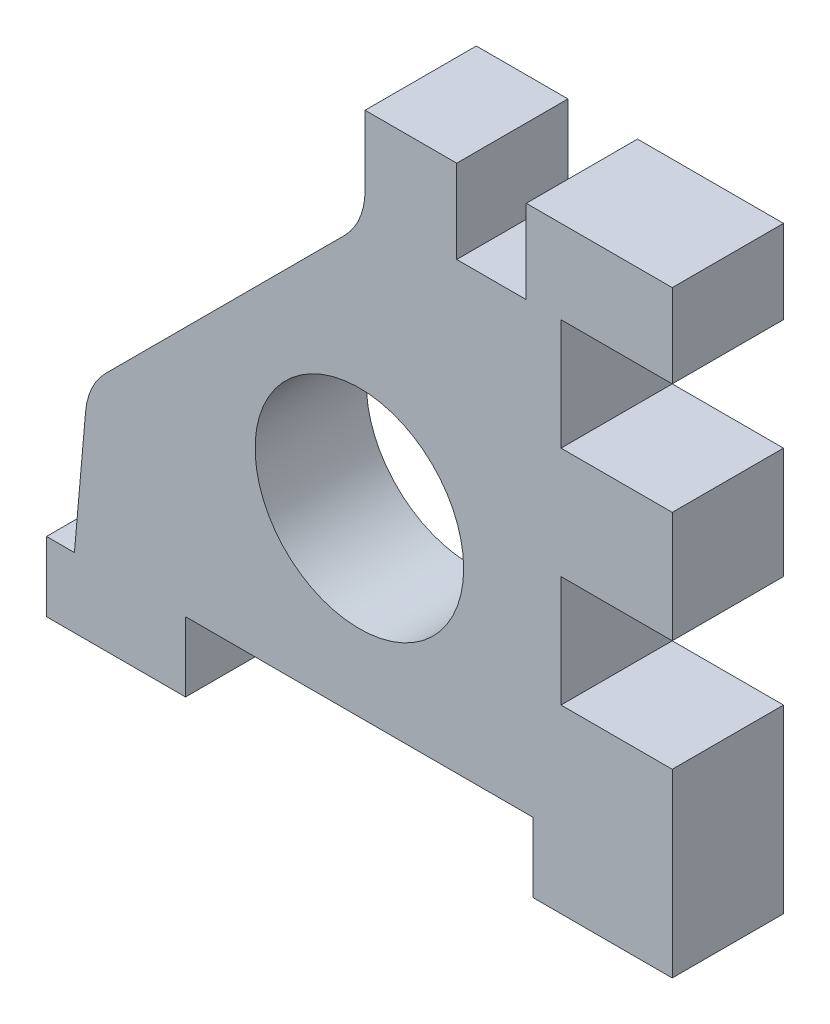
ISO-10303-21;
HEADER;
FILE_DESCRIPTION(('STEP AP214'),'2;1');
FILE_NAME('part.step','',(''),(''),'','','');
FILE_SCHEMA(('AUTOMOTIVE_DESIGN { 1 0 10303 214 1 1 1 1 }'));
ENDSEC;
DATA;
#1=APPLICATION_CONTEXT('core data for automotive mechanical design processes');
#2=APPLICATION_PROTOCOL_DEFINITION('international standard','automotive_design',2000,#1);
#3=PRODUCT_CONTEXT('',#1,'mechanical');
#4=PRODUCT('Part','Part','',(#3));
#5=PRODUCT_RELATED_PRODUCT_CATEGORY('part','',(#4));
#6=PRODUCT_DEFINITION_FORMATION('','',#4);
#7=PRODUCT_DEFINITION_CONTEXT('part definition',#1,'design');
#8=PRODUCT_DEFINITION('design','',#6,#7);
#9=PRODUCT_DEFINITION_SHAPE('','',#8);
#10=(LENGTH_UNIT() NAMED_UNIT(*) SI_UNIT(.MILLI.,.METRE.));
#11=(NAMED_UNIT(*) PLANE_ANGLE_UNIT() SI_UNIT($,.RADIAN.));
#12=(NAMED_UNIT(*) SI_UNIT($,.STERADIAN.) SOLID_ANGLE_UNIT());
#13=UNCERTAINTY_MEASURE_WITH_UNIT(LENGTH_MEASURE(1.E-05),#10,'distance_accuracy_value','');
#14=(GEOMETRIC_REPRESENTATION_CONTEXT(3) GLOBAL_UNCERTAINTY_ASSIGNED_CONTEXT((#13)) GLOBAL_UNIT_ASSIGNED_CONTEXT((#10,
#11,#12)) REPRESENTATION_CONTEXT('',''));
#15=CARTESIAN_POINT('',(0.,0.,0.));
#16=DIRECTION('',(0.,0.,1.));
#17=DIRECTION('',(1.,0.,0.));
#18=AXIS2_PLACEMENT_3D('',#15,#16,#17);
#19=CARTESIAN_POINT('',(45.,0.,8.));
#20=DIRECTION('',(-1.,0.,0.));
#21=DIRECTION('',(0.,0.,1.));
#22=AXIS2_PLACEMENT_3D('',#19,#20,#21);
#23=PLANE('',#22);
#24=DIRECTION('',(0.,1.,0.));
#25=VECTOR('',#24,1.);
#26=CARTESIAN_POINT('',(45.,0.,0.));
#27=LINE('',#26,#25);
#28=CARTESIAN_POINT('',(45.,16.,0.));
#29=VERTEX_POINT('',#28);
#30=CARTESIAN_POINT('',(45.,24.,0.));
#31=VERTEX_POINT('',#30);
#32=EDGE_CURVE('E378',#29,#31,#27,.T.);
#33=ORIENTED_EDGE('',*,*,#32,.T.);
#34=DIRECTION('',(0.,0.,1.));
#35=VECTOR('',#34,1.);
#36=CARTESIAN_POINT('',(45.,24.,8.));
#37=LINE('',#36,#35);
#38=CARTESIAN_POINT('',(45.,24.,8.));
#39=VERTEX_POINT('',#38);
#40=EDGE_CURVE('E42',#31,#39,#37,.T.);
#41=ORIENTED_EDGE('',*,*,#40,.T.);
#42=DIRECTION('',(0.,1.,0.));
#43=VECTOR('',#42,1.);
#44=CARTESIAN_POINT('',(45.,0.,8.));
#45=LINE('',#44,#43);
#46=CARTESIAN_POINT('',(45.,16.,8.));
#47=VERTEX_POINT('',#46);
#48=EDGE_CURVE('E231',#47,#39,#45,.T.);
#49=ORIENTED_EDGE('',*,*,#48,.F.);
#50=DIRECTION('',(0.,0.,-1.));
#51=VECTOR('',#50,1.);
#52=CARTESIAN_POINT('',(45.,16.,8.));
#53=LINE('',#52,#51);
#54=EDGE_CURVE('E269',#47,#29,#53,.T.);
#55=ORIENTED_EDGE('',*,*,#54,.T.);
#56=EDGE_LOOP('',(#33,#41,#49,#55));
#57=FACE_BOUND('',#56,.T.);
#58=ADVANCED_FACE('F34',(#57),#23,.F.);
#59=CARTESIAN_POINT('',(45.,-5.,0.));
#60=VERTEX_POINT('',#59);
#61=CARTESIAN_POINT('',(45.,8.,0.));
#62=VERTEX_POINT('',#61);
#63=EDGE_CURVE('E259',#60,#62,#27,.T.);
#64=ORIENTED_EDGE('',*,*,#63,.T.);
#65=DIRECTION('',(0.,0.,1.));
#66=VECTOR('',#65,1.);
#67=CARTESIAN_POINT('',(45.,8.,8.));
#68=LINE('',#67,#66);
#69=CARTESIAN_POINT('',(45.,8.,8.));
#70=VERTEX_POINT('',#69);
#71=EDGE_CURVE('E369',#62,#70,#68,.T.);
#72=ORIENTED_EDGE('',*,*,#71,.T.);
#73=CARTESIAN_POINT('',(45.,-5.,8.));
#74=VERTEX_POINT('',#73);
#75=EDGE_CURVE('E234',#74,#70,#45,.T.);
#76=ORIENTED_EDGE('',*,*,#75,.F.);
#77=DIRECTION('',(0.,0.,1.));
#78=VECTOR('',#77,1.);
#79=CARTESIAN_POINT('',(45.,-5.,8.));
#80=LINE('',#79,#78);
#81=EDGE_CURVE('E314',#60,#74,#80,.T.);
#82=ORIENTED_EDGE('',*,*,#81,.F.);
#83=EDGE_LOOP('',(#64,#72,#76,#82));
#84=FACE_BOUND('',#83,.T.);
#85=ADVANCED_FACE('F367',(#84),#23,.F.);
#86=CARTESIAN_POINT('',(45.,0.,8.));
#87=DIRECTION('',(0.,1.,0.));
#88=DIRECTION('',(-1.,0.,0.));
#89=AXIS2_PLACEMENT_3D('',#86,#87,#88);
#90=PLANE('',#89);
#91=DIRECTION('',(0.,0.,1.));
#92=VECTOR('',#91,1.);
#93=CARTESIAN_POINT('',(10.,0.,8.));
#94=LINE('',#93,#92);
#95=CARTESIAN_POINT('',(10.,0.,0.));
#96=VERTEX_POINT('',#95);
#97=CARTESIAN_POINT('',(10.,0.,8.));
#98=VERTEX_POINT('',#97);
#99=EDGE_CURVE('E340',#96,#98,#94,.T.);
#100=ORIENTED_EDGE('',*,*,#99,.F.);
#101=DIRECTION('',(1.,0.,0.));
#102=VECTOR('',#101,1.);
#103=CARTESIAN_POINT('',(45.,0.,0.));
#104=LINE('',#103,#102);
#105=CARTESIAN_POINT('',(35.,0.,0.));
#106=VERTEX_POINT('',#105);
#107=EDGE_CURVE('E262',#96,#106,#104,.T.);
#108=ORIENTED_EDGE('',*,*,#107,.T.);
#109=DIRECTION('',(0.,0.,-1.));
#110=VECTOR('',#109,1.);
#111=CARTESIAN_POINT('',(35.,0.,8.));
#112=LINE('',#111,#110);
#113=CARTESIAN_POINT('',(35.,0.,8.));
#114=VERTEX_POINT('',#113);
#115=EDGE_CURVE('E310',#114,#106,#112,.T.);
#116=ORIENTED_EDGE('',*,*,#115,.F.);
#117=DIRECTION('',(1.,0.,0.));
#118=VECTOR('',#117,1.);
#119=CARTESIAN_POINT('',(45.,0.,8.));
#120=LINE('',#119,#118);
#121=EDGE_CURVE('E232',#98,#114,#120,.T.);
#122=ORIENTED_EDGE('',*,*,#121,.F.);
#123=EDGE_LOOP('',(#100,#108,#116,#122));
#124=FACE_BOUND('',#123,.T.);
#125=ADVANCED_FACE('F338',(#124),#90,.F.);
#126=CARTESIAN_POINT('',(22.9087862886784,37.9987713148062,8.));
#127=DIRECTION('',(0.,-1.,0.));
#128=DIRECTION('',(0.,0.,-1.));
#129=AXIS2_PLACEMENT_3D('',#126,#127,#128);
#130=PLANE('',#129);
#131=DIRECTION('',(-1.,0.,0.));
#132=VECTOR('',#131,1.);
#133=CARTESIAN_POINT('',(22.9087862886784,37.9987713148062,8.));
#134=LINE('',#133,#132);
#135=CARTESIAN_POINT('',(29.5,37.9987713148063,8.));
#136=VERTEX_POINT('',#135);
#137=CARTESIAN_POINT('',(22.9087862886784,37.9987713148062,8.));
#138=VERTEX_POINT('',#137);
#139=EDGE_CURVE('E240',#136,#138,#134,.T.);
#140=ORIENTED_EDGE('',*,*,#139,.F.);
#141=DIRECTION('',(0.,0.,1.));
#142=VECTOR('',#141,1.);
#143=CARTESIAN_POINT('',(29.5,37.9987713148063,0.));
#144=LINE('',#143,#142);
#145=CARTESIAN_POINT('',(29.5,37.9987713148063,0.));
#146=VERTEX_POINT('',#145);
#147=EDGE_CURVE('E276',#146,#136,#144,.T.);
#148=ORIENTED_EDGE('',*,*,#147,.F.);
#149=DIRECTION('',(-1.,0.,0.));
#150=VECTOR('',#149,1.);
#151=CARTESIAN_POINT('',(22.9087862886784,37.9987713148062,0.));
#152=LINE('',#151,#150);
#153=CARTESIAN_POINT('',(22.9087862886784,37.9987713148062,0.));
#154=VERTEX_POINT('',#153);
#155=EDGE_CURVE('E517',#146,#154,#152,.T.);
#156=ORIENTED_EDGE('',*,*,#155,.T.);
#157=DIRECTION('',(0.,0.,-1.));
#158=VECTOR('',#157,1.);
#159=CARTESIAN_POINT('',(22.9087862886784,37.9987713148062,8.));
#160=LINE('',#159,#158);
#161=EDGE_CURVE('E488',#138,#154,#160,.T.);
#162=ORIENTED_EDGE('',*,*,#161,.F.);
#163=EDGE_LOOP('',(#140,#148,#156,#162));
#164=FACE_BOUND('',#163,.T.);
#165=ADVANCED_FACE('F460',(#164),#130,.F.);
#166=CARTESIAN_POINT('',(0.,0.,8.));
#167=DIRECTION('',(0.,0.,-1.));
#168=DIRECTION('',(-1.,0.,0.));
#169=AXIS2_PLACEMENT_3D('',#166,#167,#168);
#170=PLANE('',#169);
#171=ORIENTED_EDGE('',*,*,#48,.T.);
#172=DIRECTION('',(1.,0.,0.));
#173=VECTOR('',#172,1.);
#174=CARTESIAN_POINT('',(45.,24.,8.));
#175=LINE('',#174,#173);
#176=CARTESIAN_POINT('',(37.,24.,8.));
#177=VERTEX_POINT('',#176);
#178=EDGE_CURVE('E381',#177,#39,#175,.T.);
#179=ORIENTED_EDGE('',*,*,#178,.F.);
#180=DIRECTION('',(0.,-1.,0.));
#181=VECTOR('',#180,1.);
#182=CARTESIAN_POINT('',(37.,24.,8.));
#183=LINE('',#182,#181);
#184=CARTESIAN_POINT('',(37.,32.,8.));
#185=VERTEX_POINT('',#184);
#186=EDGE_CURVE('E225',#185,#177,#183,.T.);
#187=ORIENTED_EDGE('',*,*,#186,.F.);
#188=DIRECTION('',(-1.,0.,0.));
#189=VECTOR('',#188,1.);
#190=CARTESIAN_POINT('',(45.,32.,8.));
#191=LINE('',#190,#189);
#192=CARTESIAN_POINT('',(45.,32.,8.));
#193=VERTEX_POINT('',#192);
#194=EDGE_CURVE('E209',#193,#185,#191,.T.);
#195=ORIENTED_EDGE('',*,*,#194,.F.);
#196=CARTESIAN_POINT('',(45.,37.9987713148062,8.));
#197=VERTEX_POINT('',#196);
#198=EDGE_CURVE('E221',#193,#197,#45,.T.);
#199=ORIENTED_EDGE('',*,*,#198,.T.);
#200=CARTESIAN_POINT('',(34.5,37.9987713148062,8.));
#201=VERTEX_POINT('',#200);
#202=EDGE_CURVE('E243',#197,#201,#134,.T.);
#203=ORIENTED_EDGE('',*,*,#202,.T.);
#204=DIRECTION('',(0.,1.,0.));
#205=VECTOR('',#204,1.);
#206=CARTESIAN_POINT('',(34.5,37.9987713148062,8.));
#207=LINE('',#206,#205);
#208=CARTESIAN_POINT('',(34.5,31.9987713148063,8.));
#209=VERTEX_POINT('',#208);
#210=EDGE_CURVE('E288',#209,#201,#207,.T.);
#211=ORIENTED_EDGE('',*,*,#210,.F.);
#212=DIRECTION('',(1.,0.,0.));
#213=VECTOR('',#212,1.);
#214=CARTESIAN_POINT('',(29.5,31.9987713148063,8.));
#215=LINE('',#214,#213);
#216=CARTESIAN_POINT('',(29.5,31.9987713148063,8.));
#217=VERTEX_POINT('',#216);
#218=EDGE_CURVE('E291',#217,#209,#215,.T.);
#219=ORIENTED_EDGE('',*,*,#218,.F.);
#220=DIRECTION('',(0.,-1.,0.));
#221=VECTOR('',#220,1.);
#222=CARTESIAN_POINT('',(29.5,37.9987713148063,8.));
#223=LINE('',#222,#221);
#224=EDGE_CURVE('E294',#136,#217,#223,.T.);
#225=ORIENTED_EDGE('',*,*,#224,.F.);
#226=ORIENTED_EDGE('',*,*,#139,.T.);
#227=DIRECTION('',(0.,-1.,0.));
#228=VECTOR('',#227,1.);
#229=CARTESIAN_POINT('',(22.9087862886784,30.9387713148062,8.));
#230=LINE('',#229,#228);
#231=CARTESIAN_POINT('',(22.9087862886784,33.0098391266717,8.));
#232=VERTEX_POINT('',#231);
#233=EDGE_CURVE('E248',#138,#232,#230,.T.);
#234=ORIENTED_EDGE('',*,*,#233,.T.);
#235=CARTESIAN_POINT('',(17.9087862886783,33.0098391266717,8.));
#236=DIRECTION('',(0.,0.,-1.));
#237=DIRECTION('',(-1.,0.,0.));
#238=AXIS2_PLACEMENT_3D('',#235,#236,#237);
#239=CIRCLE('',#238,5.);
#240=CARTESIAN_POINT('',(21.4443201946111,29.474305220739,8.));
#241=VERTEX_POINT('',#240);
#242=EDGE_CURVE('E316',#232,#241,#239,.T.);
#243=ORIENTED_EDGE('',*,*,#242,.T.);
#244=DIRECTION('',(-0.707106781186551,-0.707106781186544,0.));
#245=VECTOR('',#244,1.);
#246=CARTESIAN_POINT('',(2.9700149738719,11.,8.));
#247=LINE('',#246,#245);
#248=CARTESIAN_POINT('',(4.25684407787035,12.2868291039984,8.));
#249=VERTEX_POINT('',#248);
#250=EDGE_CURVE('E251',#241,#249,#247,.T.);
#251=ORIENTED_EDGE('',*,*,#250,.T.);
#252=CARTESIAN_POINT('',(7.79237798380307,8.75129519806568,8.));
#253=DIRECTION('',(0.,0.,-1.));
#254=DIRECTION('',(-1.,0.,0.));
#255=AXIS2_PLACEMENT_3D('',#252,#253,#254);
#256=CIRCLE('',#255,5.);
#257=CARTESIAN_POINT('',(2.81140449334434,9.18707391180399,8.));
#258=VERTEX_POINT('',#257);
#259=EDGE_CURVE('E498',#249,#258,#256,.F.);
#260=ORIENTED_EDGE('',*,*,#259,.T.);
#261=DIRECTION('',(-0.0871557427476618,-0.996194698091745,0.));
#262=VECTOR('',#261,1.);
#263=CARTESIAN_POINT('',(2.00763967508669,0.,8.));
#264=LINE('',#263,#262);
#265=CARTESIAN_POINT('',(2.00763967508669,0.,8.));
#266=VERTEX_POINT('',#265);
#267=EDGE_CURVE('E254',#258,#266,#264,.T.);
#268=ORIENTED_EDGE('',*,*,#267,.T.);
#269=DIRECTION('',(-1.,0.,0.));
#270=VECTOR('',#269,1.);
#271=CARTESIAN_POINT('',(0.,0.,8.));
#272=LINE('',#271,#270);
#273=CARTESIAN_POINT('',(0.,0.,8.));
#274=VERTEX_POINT('',#273);
#275=EDGE_CURVE('E407',#266,#274,#272,.T.);
#276=ORIENTED_EDGE('',*,*,#275,.T.);
#277=DIRECTION('',(0.,1.,0.));
#278=VECTOR('',#277,1.);
#279=CARTESIAN_POINT('',(0.,-5.,8.));
#280=LINE('',#279,#278);
#281=CARTESIAN_POINT('',(0.,-5.,8.));
#282=VERTEX_POINT('',#281);
#283=EDGE_CURVE('E356',#282,#274,#280,.T.);
#284=ORIENTED_EDGE('',*,*,#283,.F.);
#285=DIRECTION('',(-1.,0.,0.));
#286=VECTOR('',#285,1.);
#287=CARTESIAN_POINT('',(0.,-5.,8.));
#288=LINE('',#287,#286);
#289=CARTESIAN_POINT('',(10.,-5.,8.));
#290=VERTEX_POINT('',#289);
#291=EDGE_CURVE('E410',#290,#282,#288,.T.);
#292=ORIENTED_EDGE('',*,*,#291,.F.);
#293=DIRECTION('',(0.,1.,0.));
#294=VECTOR('',#293,1.);
#295=CARTESIAN_POINT('',(10.,-5.,8.));
#296=LINE('',#295,#294);
#297=EDGE_CURVE('E335',#290,#98,#296,.T.);
#298=ORIENTED_EDGE('',*,*,#297,.T.);
#299=ORIENTED_EDGE('',*,*,#121,.T.);
#300=DIRECTION('',(0.,1.,0.));
#301=VECTOR('',#300,1.);
#302=CARTESIAN_POINT('',(35.,-5.,8.));
#303=LINE('',#302,#301);
#304=CARTESIAN_POINT('',(35.,-5.,8.));
#305=VERTEX_POINT('',#304);
#306=EDGE_CURVE('E297',#305,#114,#303,.T.);
#307=ORIENTED_EDGE('',*,*,#306,.F.);
#308=DIRECTION('',(-1.,0.,0.));
#309=VECTOR('',#308,1.);
#310=CARTESIAN_POINT('',(45.,-5.,8.));
#311=LINE('',#310,#309);
#312=EDGE_CURVE('E330',#74,#305,#311,.T.);
#313=ORIENTED_EDGE('',*,*,#312,.F.);
#314=ORIENTED_EDGE('',*,*,#75,.T.);
#315=DIRECTION('',(1.,0.,0.));
#316=VECTOR('',#315,1.);
#317=CARTESIAN_POINT('',(45.,8.,8.));
#318=LINE('',#317,#316);
#319=CARTESIAN_POINT('',(37.,8.,8.));
#320=VERTEX_POINT('',#319);
#321=EDGE_CURVE('E389',#320,#70,#318,.T.);
#322=ORIENTED_EDGE('',*,*,#321,.F.);
#323=DIRECTION('',(0.,-1.,0.));
#324=VECTOR('',#323,1.);
#325=CARTESIAN_POINT('',(37.,8.,8.));
#326=LINE('',#325,#324);
#327=CARTESIAN_POINT('',(37.,16.,8.));
#328=VERTEX_POINT('',#327);
#329=EDGE_CURVE('E386',#328,#320,#326,.T.);
#330=ORIENTED_EDGE('',*,*,#329,.F.);
#331=DIRECTION('',(-1.,0.,0.));
#332=VECTOR('',#331,1.);
#333=CARTESIAN_POINT('',(45.,16.,8.));
#334=LINE('',#333,#332);
#335=EDGE_CURVE('E384',#47,#328,#334,.T.);
#336=ORIENTED_EDGE('',*,*,#335,.F.);
#337=EDGE_LOOP('',(#171,#179,#187,#195,#199,#203,#211,#219,#225,#226,#234,#243,#251,#260,#268,
#276,#284,#292,#298,#299,#307,#313,#314,#322,#330,#336));
#338=FACE_BOUND('',#337,.T.);
#339=CARTESIAN_POINT('',(22.5,13.,8.));
#340=DIRECTION('',(0.,0.,1.));
#341=DIRECTION('',(1.,0.,0.));
#342=AXIS2_PLACEMENT_3D('',#339,#340,#341);
#343=CIRCLE('',#342,7.5);
#344=CARTESIAN_POINT('',(30.,13.,8.));
#345=VERTEX_POINT('',#344);
#346=EDGE_CURVE('E265',#345,#345,#343,.T.);
#347=ORIENTED_EDGE('',*,*,#346,.F.);
#348=EDGE_LOOP('',(#347));
#349=FACE_BOUND('',#348,.T.);
#350=ADVANCED_FACE('F218',(#338,#349),#170,.F.);
#351=CARTESIAN_POINT('',(0.,0.,0.));
#352=DIRECTION('',(0.,0.,-1.));
#353=DIRECTION('',(-1.,0.,0.));
#354=AXIS2_PLACEMENT_3D('',#351,#352,#353);
#355=PLANE('',#354);
#356=DIRECTION('',(-1.,0.,0.));
#357=VECTOR('',#356,1.);
#358=CARTESIAN_POINT('',(0.,24.,0.));
#359=LINE('',#358,#357);
#360=CARTESIAN_POINT('',(37.,24.,0.));
#361=VERTEX_POINT('',#360);
#362=EDGE_CURVE('E387',#31,#361,#359,.T.);
#363=ORIENTED_EDGE('',*,*,#362,.F.);
#364=ORIENTED_EDGE('',*,*,#32,.F.);
#365=DIRECTION('',(1.,0.,0.));
#366=VECTOR('',#365,1.);
#367=CARTESIAN_POINT('',(0.,16.,0.));
#368=LINE('',#367,#366);
#369=CARTESIAN_POINT('',(37.,16.,0.));
#370=VERTEX_POINT('',#369);
#371=EDGE_CURVE('E57',#370,#29,#368,.T.);
#372=ORIENTED_EDGE('',*,*,#371,.F.);
#373=DIRECTION('',(0.,1.,0.));
#374=VECTOR('',#373,1.);
#375=CARTESIAN_POINT('',(37.,0.,0.));
#376=LINE('',#375,#374);
#377=CARTESIAN_POINT('',(37.,8.,0.));
#378=VERTEX_POINT('',#377);
#379=EDGE_CURVE('E214',#378,#370,#376,.T.);
#380=ORIENTED_EDGE('',*,*,#379,.F.);
#381=DIRECTION('',(-1.,0.,0.));
#382=VECTOR('',#381,1.);
#383=CARTESIAN_POINT('',(0.,7.99999999999999,0.));
#384=LINE('',#383,#382);
#385=EDGE_CURVE('E400',#62,#378,#384,.T.);
#386=ORIENTED_EDGE('',*,*,#385,.F.);
#387=ORIENTED_EDGE('',*,*,#63,.F.);
#388=DIRECTION('',(1.,0.,0.));
#389=VECTOR('',#388,1.);
#390=CARTESIAN_POINT('',(45.,-5.,0.));
#391=LINE('',#390,#389);
#392=CARTESIAN_POINT('',(35.,-5.,0.));
#393=VERTEX_POINT('',#392);
#394=EDGE_CURVE('E307',#393,#60,#391,.T.);
#395=ORIENTED_EDGE('',*,*,#394,.F.);
#396=DIRECTION('',(0.,1.,0.));
#397=VECTOR('',#396,1.);
#398=CARTESIAN_POINT('',(35.,-5.,0.));
#399=LINE('',#398,#397);
#400=EDGE_CURVE('E318',#393,#106,#399,.T.);
#401=ORIENTED_EDGE('',*,*,#400,.T.);
#402=ORIENTED_EDGE('',*,*,#107,.F.);
#403=DIRECTION('',(0.,1.,0.));
#404=VECTOR('',#403,1.);
#405=CARTESIAN_POINT('',(10.,-5.,0.));
#406=LINE('',#405,#404);
#407=CARTESIAN_POINT('',(10.,-5.,0.));
#408=VERTEX_POINT('',#407);
#409=EDGE_CURVE('E347',#408,#96,#406,.T.);
#410=ORIENTED_EDGE('',*,*,#409,.F.);
#411=DIRECTION('',(1.,0.,0.));
#412=VECTOR('',#411,1.);
#413=CARTESIAN_POINT('',(0.,-5.,0.));
#414=LINE('',#413,#412);
#415=CARTESIAN_POINT('',(0.,-5.,0.));
#416=VERTEX_POINT('',#415);
#417=EDGE_CURVE('E406',#416,#408,#414,.T.);
#418=ORIENTED_EDGE('',*,*,#417,.F.);
#419=DIRECTION('',(0.,1.,0.));
#420=VECTOR('',#419,1.);
#421=CARTESIAN_POINT('',(0.,-5.,0.));
#422=LINE('',#421,#420);
#423=CARTESIAN_POINT('',(0.,0.,0.));
#424=VERTEX_POINT('',#423);
#425=EDGE_CURVE('E315',#416,#424,#422,.T.);
#426=ORIENTED_EDGE('',*,*,#425,.T.);
#427=DIRECTION('',(1.,0.,0.));
#428=VECTOR('',#427,1.);
#429=CARTESIAN_POINT('',(0.,0.,0.));
#430=LINE('',#429,#428);
#431=CARTESIAN_POINT('',(2.0076396750867,0.,0.));
#432=VERTEX_POINT('',#431);
#433=EDGE_CURVE('E414',#424,#432,#430,.T.);
#434=ORIENTED_EDGE('',*,*,#433,.T.);
#435=DIRECTION('',(-0.0871557427476618,-0.996194698091745,0.));
#436=VECTOR('',#435,1.);
#437=CARTESIAN_POINT('',(2.00763967508669,0.,0.));
#438=LINE('',#437,#436);
#439=CARTESIAN_POINT('',(2.81140449334434,9.18707391180399,0.));
#440=VERTEX_POINT('',#439);
#441=EDGE_CURVE('E235',#440,#432,#438,.T.);
#442=ORIENTED_EDGE('',*,*,#441,.F.);
#443=CARTESIAN_POINT('',(7.79237798380307,8.75129519806568,0.));
#444=DIRECTION('',(0.,0.,-1.));
#445=DIRECTION('',(-1.,0.,0.));
#446=AXIS2_PLACEMENT_3D('',#443,#444,#445);
#447=CIRCLE('',#446,5.);
#448=CARTESIAN_POINT('',(4.25684407787035,12.2868291039984,0.));
#449=VERTEX_POINT('',#448);
#450=EDGE_CURVE('E506',#440,#449,#447,.T.);
#451=ORIENTED_EDGE('',*,*,#450,.T.);
#452=DIRECTION('',(-0.707106781186551,-0.707106781186544,0.));
#453=VECTOR('',#452,1.);
#454=CARTESIAN_POINT('',(2.9700149738719,11.,0.));
#455=LINE('',#454,#453);
#456=CARTESIAN_POINT('',(21.4443201946111,29.474305220739,0.));
#457=VERTEX_POINT('',#456);
#458=EDGE_CURVE('E490',#457,#449,#455,.T.);
#459=ORIENTED_EDGE('',*,*,#458,.F.);
#460=CARTESIAN_POINT('',(17.9087862886783,33.0098391266717,0.));
#461=DIRECTION('',(0.,0.,-1.));
#462=DIRECTION('',(-1.,0.,0.));
#463=AXIS2_PLACEMENT_3D('',#460,#461,#462);
#464=CIRCLE('',#463,5.);
#465=CARTESIAN_POINT('',(22.9087862886784,33.0098391266717,0.));
#466=VERTEX_POINT('',#465);
#467=EDGE_CURVE('E496',#457,#466,#464,.F.);
#468=ORIENTED_EDGE('',*,*,#467,.T.);
#469=DIRECTION('',(0.,-1.,0.));
#470=VECTOR('',#469,1.);
#471=CARTESIAN_POINT('',(22.9087862886784,30.9387713148062,0.));
#472=LINE('',#471,#470);
#473=EDGE_CURVE('E484',#154,#466,#472,.T.);
#474=ORIENTED_EDGE('',*,*,#473,.F.);
#475=ORIENTED_EDGE('',*,*,#155,.F.);
#476=DIRECTION('',(0.,-1.,0.));
#477=VECTOR('',#476,1.);
#478=CARTESIAN_POINT('',(29.5,37.9987713148063,0.));
#479=LINE('',#478,#477);
#480=CARTESIAN_POINT('',(29.5,31.9987713148063,0.));
#481=VERTEX_POINT('',#480);
#482=EDGE_CURVE('E290',#146,#481,#479,.T.);
#483=ORIENTED_EDGE('',*,*,#482,.T.);
#484=DIRECTION('',(1.,0.,0.));
#485=VECTOR('',#484,1.);
#486=CARTESIAN_POINT('',(29.5,31.9987713148063,0.));
#487=LINE('',#486,#485);
#488=CARTESIAN_POINT('',(34.5,31.9987713148063,0.));
#489=VERTEX_POINT('',#488);
#490=EDGE_CURVE('E300',#481,#489,#487,.T.);
#491=ORIENTED_EDGE('',*,*,#490,.T.);
#492=DIRECTION('',(0.,1.,0.));
#493=VECTOR('',#492,1.);
#494=CARTESIAN_POINT('',(34.5,37.9987713148062,0.));
#495=LINE('',#494,#493);
#496=CARTESIAN_POINT('',(34.5,37.9987713148062,0.));
#497=VERTEX_POINT('',#496);
#498=EDGE_CURVE('E282',#489,#497,#495,.T.);
#499=ORIENTED_EDGE('',*,*,#498,.T.);
#500=CARTESIAN_POINT('',(45.,37.9987713148062,0.));
#501=VERTEX_POINT('',#500);
#502=EDGE_CURVE('E491',#501,#497,#152,.T.);
#503=ORIENTED_EDGE('',*,*,#502,.F.);
#504=CARTESIAN_POINT('',(45.,32.,0.));
#505=VERTEX_POINT('',#504);
#506=EDGE_CURVE('E264',#505,#501,#27,.T.);
#507=ORIENTED_EDGE('',*,*,#506,.F.);
#508=DIRECTION('',(1.,0.,0.));
#509=VECTOR('',#508,1.);
#510=CARTESIAN_POINT('',(0.,32.,0.));
#511=LINE('',#510,#509);
#512=CARTESIAN_POINT('',(37.,32.,0.));
#513=VERTEX_POINT('',#512);
#514=EDGE_CURVE('E49',#513,#505,#511,.T.);
#515=ORIENTED_EDGE('',*,*,#514,.F.);
#516=DIRECTION('',(0.,1.,0.));
#517=VECTOR('',#516,1.);
#518=CARTESIAN_POINT('',(37.,0.,0.));
#519=LINE('',#518,#517);
#520=EDGE_CURVE('E11',#361,#513,#519,.T.);
#521=ORIENTED_EDGE('',*,*,#520,.F.);
#522=EDGE_LOOP('',(#363,#364,#372,#380,#386,#387,#395,#401,#402,#410,#418,#426,#434,#442,#451,
#459,#468,#474,#475,#483,#491,#499,#503,#507,#515,#521));
#523=FACE_BOUND('',#522,.T.);
#524=CARTESIAN_POINT('',(22.5,13.,0.));
#525=DIRECTION('',(0.,0.,1.));
#526=DIRECTION('',(1.,0.,0.));
#527=AXIS2_PLACEMENT_3D('',#524,#525,#526);
#528=CIRCLE('',#527,7.5);
#529=CARTESIAN_POINT('',(30.,13.,0.));
#530=VERTEX_POINT('',#529);
#531=EDGE_CURVE('E273',#530,#530,#528,.T.);
#532=ORIENTED_EDGE('',*,*,#531,.T.);
#533=EDGE_LOOP('',(#532));
#534=FACE_BOUND('',#533,.T.);
#535=ADVANCED_FACE('F345',(#523,#534),#355,.T.);
#536=ORIENTED_EDGE('',*,*,#198,.F.);
#537=DIRECTION('',(0.,0.,-1.));
#538=VECTOR('',#537,1.);
#539=CARTESIAN_POINT('',(45.,32.,8.));
#540=LINE('',#539,#538);
#541=EDGE_CURVE('E206',#193,#505,#540,.T.);
#542=ORIENTED_EDGE('',*,*,#541,.T.);
#543=ORIENTED_EDGE('',*,*,#506,.T.);
#544=DIRECTION('',(0.,0.,-1.));
#545=VECTOR('',#544,1.);
#546=CARTESIAN_POINT('',(45.,37.9987713148062,8.));
#547=LINE('',#546,#545);
#548=EDGE_CURVE('E229',#197,#501,#547,.T.);
#549=ORIENTED_EDGE('',*,*,#548,.F.);
#550=EDGE_LOOP('',(#536,#542,#543,#549));
#551=FACE_BOUND('',#550,.T.);
#552=ADVANCED_FACE('F227',(#551),#23,.F.);
#553=ORIENTED_EDGE('',*,*,#502,.T.);
#554=DIRECTION('',(0.,0.,1.));
#555=VECTOR('',#554,1.);
#556=CARTESIAN_POINT('',(34.5,37.9987713148062,0.));
#557=LINE('',#556,#555);
#558=EDGE_CURVE('E284',#497,#201,#557,.T.);
#559=ORIENTED_EDGE('',*,*,#558,.T.);
#560=ORIENTED_EDGE('',*,*,#202,.F.);
#561=ORIENTED_EDGE('',*,*,#548,.T.);
#562=EDGE_LOOP('',(#553,#559,#560,#561));
#563=FACE_BOUND('',#562,.T.);
#564=ADVANCED_FACE('F453',(#563),#130,.F.);
#565=CARTESIAN_POINT('',(22.9087862886784,30.9387713148062,8.));
#566=DIRECTION('',(1.,0.,0.));
#567=DIRECTION('',(0.,1.,0.));
#568=AXIS2_PLACEMENT_3D('',#565,#566,#567);
#569=PLANE('',#568);
#570=ORIENTED_EDGE('',*,*,#473,.T.);
#571=DIRECTION('',(0.,0.,-1.));
#572=VECTOR('',#571,1.);
#573=CARTESIAN_POINT('',(22.9087862886784,33.0098391266717,8.));
#574=LINE('',#573,#572);
#575=EDGE_CURVE('E487',#466,#232,#574,.F.);
#576=ORIENTED_EDGE('',*,*,#575,.T.);
#577=ORIENTED_EDGE('',*,*,#233,.F.);
#578=ORIENTED_EDGE('',*,*,#161,.T.);
#579=EDGE_LOOP('',(#570,#576,#577,#578));
#580=FACE_BOUND('',#579,.T.);
#581=ADVANCED_FACE('F458',(#580),#569,.F.);
#582=CARTESIAN_POINT('',(2.9700149738719,11.,8.));
#583=DIRECTION('',(0.707106781186544,-0.707106781186551,0.));
#584=DIRECTION('',(0.707106781186551,0.707106781186544,0.));
#585=AXIS2_PLACEMENT_3D('',#582,#583,#584);
#586=PLANE('',#585);
#587=ORIENTED_EDGE('',*,*,#458,.T.);
#588=DIRECTION('',(0.,0.,-1.));
#589=VECTOR('',#588,1.);
#590=CARTESIAN_POINT('',(4.25684407787035,12.2868291039984,8.));
#591=LINE('',#590,#589);
#592=EDGE_CURVE('E500',#449,#249,#591,.F.);
#593=ORIENTED_EDGE('',*,*,#592,.T.);
#594=ORIENTED_EDGE('',*,*,#250,.F.);
#595=DIRECTION('',(0.,0.,-1.));
#596=VECTOR('',#595,1.);
#597=CARTESIAN_POINT('',(21.4443201946111,29.474305220739,0.));
#598=LINE('',#597,#596);
#599=EDGE_CURVE('E504',#241,#457,#598,.T.);
#600=ORIENTED_EDGE('',*,*,#599,.T.);
#601=EDGE_LOOP('',(#587,#593,#594,#600));
#602=FACE_BOUND('',#601,.T.);
#603=ADVANCED_FACE('F472',(#602),#586,.F.);
#604=CARTESIAN_POINT('',(2.00763967508669,0.,8.));
#605=DIRECTION('',(0.996194698091745,-0.0871557427476618,0.));
#606=DIRECTION('',(0.0871557427476618,0.996194698091745,0.));
#607=AXIS2_PLACEMENT_3D('',#604,#605,#606);
#608=PLANE('',#607);
#609=ORIENTED_EDGE('',*,*,#267,.F.);
#610=DIRECTION('',(0.,0.,-1.));
#611=VECTOR('',#610,1.);
#612=CARTESIAN_POINT('',(2.81140449334434,9.18707391180399,8.));
#613=LINE('',#612,#611);
#614=EDGE_CURVE('E508',#258,#440,#613,.T.);
#615=ORIENTED_EDGE('',*,*,#614,.T.);
#616=ORIENTED_EDGE('',*,*,#441,.T.);
#617=DIRECTION('',(0.,0.,-1.));
#618=VECTOR('',#617,1.);
#619=CARTESIAN_POINT('',(2.00763967508669,0.,8.));
#620=LINE('',#619,#618);
#621=EDGE_CURVE('E256',#266,#432,#620,.T.);
#622=ORIENTED_EDGE('',*,*,#621,.F.);
#623=EDGE_LOOP('',(#609,#615,#616,#622));
#624=FACE_BOUND('',#623,.T.);
#625=ADVANCED_FACE('F468',(#624),#608,.F.);
#626=CARTESIAN_POINT('',(22.5,13.,8.));
#627=DIRECTION('',(0.,0.,-1.));
#628=DIRECTION('',(-1.,0.,0.));
#629=AXIS2_PLACEMENT_3D('',#626,#627,#628);
#630=CYLINDRICAL_SURFACE('',#629,7.5);
#631=ORIENTED_EDGE('',*,*,#346,.T.);
#632=EDGE_LOOP('',(#631));
#633=FACE_BOUND('',#632,.T.);
#634=ORIENTED_EDGE('',*,*,#531,.F.);
#635=EDGE_LOOP('',(#634));
#636=FACE_BOUND('',#635,.T.);
#637=ADVANCED_FACE('F471',(#633,#636),#630,.F.);
#638=CARTESIAN_POINT('',(7.79237798380307,8.75129519806568,8.));
#639=DIRECTION('',(0.,0.,-1.));
#640=DIRECTION('',(-1.,0.,0.));
#641=AXIS2_PLACEMENT_3D('',#638,#639,#640);
#642=CYLINDRICAL_SURFACE('',#641,5.);
#643=ORIENTED_EDGE('',*,*,#259,.F.);
#644=ORIENTED_EDGE('',*,*,#592,.F.);
#645=ORIENTED_EDGE('',*,*,#450,.F.);
#646=ORIENTED_EDGE('',*,*,#614,.F.);
#647=EDGE_LOOP('',(#643,#644,#645,#646));
#648=FACE_BOUND('',#647,.T.);
#649=ADVANCED_FACE('F536',(#648),#642,.T.);
#650=CARTESIAN_POINT('',(17.9087862886783,33.0098391266717,8.));
#651=DIRECTION('',(0.,0.,1.));
#652=DIRECTION('',(1.,0.,0.));
#653=AXIS2_PLACEMENT_3D('',#650,#651,#652);
#654=CYLINDRICAL_SURFACE('',#653,5.);
#655=ORIENTED_EDGE('',*,*,#242,.F.);
#656=ORIENTED_EDGE('',*,*,#575,.F.);
#657=ORIENTED_EDGE('',*,*,#467,.F.);
#658=ORIENTED_EDGE('',*,*,#599,.F.);
#659=EDGE_LOOP('',(#655,#656,#657,#658));
#660=FACE_BOUND('',#659,.T.);
#661=ADVANCED_FACE('F36',(#660),#654,.F.);
#662=CARTESIAN_POINT('',(29.5,37.9987713148063,0.));
#663=DIRECTION('',(-1.,0.,0.));
#664=DIRECTION('',(0.,0.,1.));
#665=AXIS2_PLACEMENT_3D('',#662,#663,#664);
#666=PLANE('',#665);
#667=ORIENTED_EDGE('',*,*,#224,.T.);
#668=DIRECTION('',(0.,0.,1.));
#669=VECTOR('',#668,1.);
#670=CARTESIAN_POINT('',(29.5,31.9987713148063,0.));
#671=LINE('',#670,#669);
#672=EDGE_CURVE('E279',#481,#217,#671,.T.);
#673=ORIENTED_EDGE('',*,*,#672,.F.);
#674=ORIENTED_EDGE('',*,*,#482,.F.);
#675=ORIENTED_EDGE('',*,*,#147,.T.);
#676=EDGE_LOOP('',(#667,#673,#674,#675));
#677=FACE_BOUND('',#676,.T.);
#678=ADVANCED_FACE('F530',(#677),#666,.F.);
#679=CARTESIAN_POINT('',(34.5,37.9987713148062,0.));
#680=DIRECTION('',(1.,0.,0.));
#681=DIRECTION('',(0.,0.,-1.));
#682=AXIS2_PLACEMENT_3D('',#679,#680,#681);
#683=PLANE('',#682);
#684=ORIENTED_EDGE('',*,*,#210,.T.);
#685=ORIENTED_EDGE('',*,*,#558,.F.);
#686=ORIENTED_EDGE('',*,*,#498,.F.);
#687=DIRECTION('',(0.,0.,1.));
#688=VECTOR('',#687,1.);
#689=CARTESIAN_POINT('',(34.5,31.9987713148063,0.));
#690=LINE('',#689,#688);
#691=EDGE_CURVE('E281',#489,#209,#690,.T.);
#692=ORIENTED_EDGE('',*,*,#691,.T.);
#693=EDGE_LOOP('',(#684,#685,#686,#692));
#694=FACE_BOUND('',#693,.T.);
#695=ADVANCED_FACE('F524',(#694),#683,.F.);
#696=CARTESIAN_POINT('',(29.5,31.9987713148063,0.));
#697=DIRECTION('',(0.,-1.,0.));
#698=DIRECTION('',(0.,0.,-1.));
#699=AXIS2_PLACEMENT_3D('',#696,#697,#698);
#700=PLANE('',#699);
#701=ORIENTED_EDGE('',*,*,#218,.T.);
#702=ORIENTED_EDGE('',*,*,#691,.F.);
#703=ORIENTED_EDGE('',*,*,#490,.F.);
#704=ORIENTED_EDGE('',*,*,#672,.T.);
#705=EDGE_LOOP('',(#701,#702,#703,#704));
#706=FACE_BOUND('',#705,.T.);
#707=ADVANCED_FACE('F528',(#706),#700,.F.);
#708=CARTESIAN_POINT('',(35.,-5.,8.));
#709=DIRECTION('',(1.,0.,0.));
#710=DIRECTION('',(0.,1.,0.));
#711=AXIS2_PLACEMENT_3D('',#708,#709,#710);
#712=PLANE('',#711);
#713=ORIENTED_EDGE('',*,*,#115,.T.);
#714=ORIENTED_EDGE('',*,*,#400,.F.);
#715=DIRECTION('',(0.,0.,-1.));
#716=VECTOR('',#715,1.);
#717=CARTESIAN_POINT('',(35.,-5.,8.));
#718=LINE('',#717,#716);
#719=EDGE_CURVE('E329',#305,#393,#718,.T.);
#720=ORIENTED_EDGE('',*,*,#719,.F.);
#721=ORIENTED_EDGE('',*,*,#306,.T.);
#722=EDGE_LOOP('',(#713,#714,#720,#721));
#723=FACE_BOUND('',#722,.T.);
#724=ADVANCED_FACE('F326',(#723),#712,.F.);
#725=CARTESIAN_POINT('',(0.,-5.,0.));
#726=DIRECTION('',(0.,1.,0.));
#727=DIRECTION('',(-1.,0.,0.));
#728=AXIS2_PLACEMENT_3D('',#725,#726,#727);
#729=PLANE('',#728);
#730=ORIENTED_EDGE('',*,*,#81,.T.);
#731=ORIENTED_EDGE('',*,*,#312,.T.);
#732=ORIENTED_EDGE('',*,*,#719,.T.);
#733=ORIENTED_EDGE('',*,*,#394,.T.);
#734=EDGE_LOOP('',(#730,#731,#732,#733));
#735=FACE_BOUND('',#734,.T.);
#736=ADVANCED_FACE('F364',(#735),#729,.F.);
#737=CARTESIAN_POINT('',(0.,0.,0.));
#738=DIRECTION('',(0.,-1.,0.));
#739=DIRECTION('',(1.,0.,0.));
#740=AXIS2_PLACEMENT_3D('',#737,#738,#739);
#741=PLANE('',#740);
#742=ORIENTED_EDGE('',*,*,#275,.F.);
#743=ORIENTED_EDGE('',*,*,#621,.T.);
#744=ORIENTED_EDGE('',*,*,#433,.F.);
#745=DIRECTION('',(0.,0.,-1.));
#746=VECTOR('',#745,1.);
#747=CARTESIAN_POINT('',(0.,0.,8.));
#748=LINE('',#747,#746);
#749=EDGE_CURVE('E402',#274,#424,#748,.T.);
#750=ORIENTED_EDGE('',*,*,#749,.F.);
#751=EDGE_LOOP('',(#742,#743,#744,#750));
#752=FACE_BOUND('',#751,.T.);
#753=ADVANCED_FACE('F427',(#752),#741,.F.);
#754=CARTESIAN_POINT('',(0.,-5.,8.));
#755=DIRECTION('',(1.,0.,0.));
#756=DIRECTION('',(0.,1.,0.));
#757=AXIS2_PLACEMENT_3D('',#754,#755,#756);
#758=PLANE('',#757);
#759=ORIENTED_EDGE('',*,*,#749,.T.);
#760=ORIENTED_EDGE('',*,*,#425,.F.);
#761=DIRECTION('',(0.,0.,-1.));
#762=VECTOR('',#761,1.);
#763=CARTESIAN_POINT('',(0.,-5.,8.));
#764=LINE('',#763,#762);
#765=EDGE_CURVE('E403',#282,#416,#764,.T.);
#766=ORIENTED_EDGE('',*,*,#765,.F.);
#767=ORIENTED_EDGE('',*,*,#283,.T.);
#768=EDGE_LOOP('',(#759,#760,#766,#767));
#769=FACE_BOUND('',#768,.T.);
#770=ADVANCED_FACE('F423',(#769),#758,.F.);
#771=CARTESIAN_POINT('',(10.,-5.,8.));
#772=DIRECTION('',(-1.,0.,0.));
#773=DIRECTION('',(0.,0.,1.));
#774=AXIS2_PLACEMENT_3D('',#771,#772,#773);
#775=PLANE('',#774);
#776=ORIENTED_EDGE('',*,*,#99,.T.);
#777=ORIENTED_EDGE('',*,*,#297,.F.);
#778=DIRECTION('',(0.,0.,1.));
#779=VECTOR('',#778,1.);
#780=CARTESIAN_POINT('',(10.,-5.,8.));
#781=LINE('',#780,#779);
#782=EDGE_CURVE('E352',#408,#290,#781,.T.);
#783=ORIENTED_EDGE('',*,*,#782,.F.);
#784=ORIENTED_EDGE('',*,*,#409,.T.);
#785=EDGE_LOOP('',(#776,#777,#783,#784));
#786=FACE_BOUND('',#785,.T.);
#787=ADVANCED_FACE('F351',(#786),#775,.F.);
#788=CARTESIAN_POINT('',(0.,-5.,0.));
#789=DIRECTION('',(0.,-1.,0.));
#790=DIRECTION('',(1.,0.,0.));
#791=AXIS2_PLACEMENT_3D('',#788,#789,#790);
#792=PLANE('',#791);
#793=ORIENTED_EDGE('',*,*,#765,.T.);
#794=ORIENTED_EDGE('',*,*,#417,.T.);
#795=ORIENTED_EDGE('',*,*,#782,.T.);
#796=ORIENTED_EDGE('',*,*,#291,.T.);
#797=EDGE_LOOP('',(#793,#794,#795,#796));
#798=FACE_BOUND('',#797,.T.);
#799=ADVANCED_FACE('F432',(#798),#792,.T.);
#800=CARTESIAN_POINT('',(45.,8.,-5.00000000014378E-05));
#801=DIRECTION('',(0.,-1.,0.));
#802=DIRECTION('',(1.,0.,0.));
#803=AXIS2_PLACEMENT_3D('',#800,#801,#802);
#804=PLANE('',#803);
#805=ORIENTED_EDGE('',*,*,#385,.T.);
#806=DIRECTION('',(0.,0.,1.));
#807=VECTOR('',#806,1.);
#808=CARTESIAN_POINT('',(37.,8.,-5.00000000014378E-05));
#809=LINE('',#808,#807);
#810=EDGE_CURVE('E396',#378,#320,#809,.T.);
#811=ORIENTED_EDGE('',*,*,#810,.T.);
#812=ORIENTED_EDGE('',*,*,#321,.T.);
#813=ORIENTED_EDGE('',*,*,#71,.F.);
#814=EDGE_LOOP('',(#805,#811,#812,#813));
#815=FACE_BOUND('',#814,.T.);
#816=ADVANCED_FACE('F434',(#815),#804,.F.);
#817=CARTESIAN_POINT('',(37.,8.,-5.00000000014378E-05));
#818=DIRECTION('',(-1.,0.,0.));
#819=DIRECTION('',(0.,0.,1.));
#820=AXIS2_PLACEMENT_3D('',#817,#818,#819);
#821=PLANE('',#820);
#822=ORIENTED_EDGE('',*,*,#379,.T.);
#823=DIRECTION('',(0.,0.,1.));
#824=VECTOR('',#823,1.);
#825=CARTESIAN_POINT('',(37.,16.,-5.00000000014378E-05));
#826=LINE('',#825,#824);
#827=EDGE_CURVE('E395',#370,#328,#826,.T.);
#828=ORIENTED_EDGE('',*,*,#827,.T.);
#829=ORIENTED_EDGE('',*,*,#329,.T.);
#830=ORIENTED_EDGE('',*,*,#810,.F.);
#831=EDGE_LOOP('',(#822,#828,#829,#830));
#832=FACE_BOUND('',#831,.T.);
#833=ADVANCED_FACE('F440',(#832),#821,.F.);
#834=CARTESIAN_POINT('',(45.,16.,-5.00000000014378E-05));
#835=DIRECTION('',(0.,1.,0.));
#836=DIRECTION('',(0.,0.,1.));
#837=AXIS2_PLACEMENT_3D('',#834,#835,#836);
#838=PLANE('',#837);
#839=ORIENTED_EDGE('',*,*,#371,.T.);
#840=ORIENTED_EDGE('',*,*,#54,.F.);
#841=ORIENTED_EDGE('',*,*,#335,.T.);
#842=ORIENTED_EDGE('',*,*,#827,.F.);
#843=EDGE_LOOP('',(#839,#840,#841,#842));
#844=FACE_BOUND('',#843,.T.);
#845=ADVANCED_FACE('F588',(#844),#838,.F.);
#846=CARTESIAN_POINT('',(45.,24.,-5.00000000014378E-05));
#847=DIRECTION('',(0.,-1.,0.));
#848=DIRECTION('',(1.,0.,0.));
#849=AXIS2_PLACEMENT_3D('',#846,#847,#848);
#850=PLANE('',#849);
#851=ORIENTED_EDGE('',*,*,#362,.T.);
#852=DIRECTION('',(0.,0.,1.));
#853=VECTOR('',#852,1.);
#854=CARTESIAN_POINT('',(37.,24.,-5.00000000014378E-05));
#855=LINE('',#854,#853);
#856=EDGE_CURVE('E630',#361,#177,#855,.T.);
#857=ORIENTED_EDGE('',*,*,#856,.T.);
#858=ORIENTED_EDGE('',*,*,#178,.T.);
#859=ORIENTED_EDGE('',*,*,#40,.F.);
#860=EDGE_LOOP('',(#851,#857,#858,#859));
#861=FACE_BOUND('',#860,.T.);
#862=ADVANCED_FACE('F598',(#861),#850,.F.);
#863=CARTESIAN_POINT('',(37.,24.,-5.00000000014378E-05));
#864=DIRECTION('',(-1.,0.,0.));
#865=DIRECTION('',(0.,0.,1.));
#866=AXIS2_PLACEMENT_3D('',#863,#864,#865);
#867=PLANE('',#866);
#868=ORIENTED_EDGE('',*,*,#520,.T.);
#869=DIRECTION('',(0.,0.,1.));
#870=VECTOR('',#869,1.);
#871=CARTESIAN_POINT('',(37.,32.,-5.00000000014378E-05));
#872=LINE('',#871,#870);
#873=EDGE_CURVE('E629',#513,#185,#872,.T.);
#874=ORIENTED_EDGE('',*,*,#873,.T.);
#875=ORIENTED_EDGE('',*,*,#186,.T.);
#876=ORIENTED_EDGE('',*,*,#856,.F.);
#877=EDGE_LOOP('',(#868,#874,#875,#876));
#878=FACE_BOUND('',#877,.T.);
#879=ADVANCED_FACE('F606',(#878),#867,.F.);
#880=CARTESIAN_POINT('',(45.,32.,-5.00000000014378E-05));
#881=DIRECTION('',(0.,1.,0.));
#882=DIRECTION('',(0.,0.,1.));
#883=AXIS2_PLACEMENT_3D('',#880,#881,#882);
#884=PLANE('',#883);
#885=ORIENTED_EDGE('',*,*,#514,.T.);
#886=ORIENTED_EDGE('',*,*,#541,.F.);
#887=ORIENTED_EDGE('',*,*,#194,.T.);
#888=ORIENTED_EDGE('',*,*,#873,.F.);
#889=EDGE_LOOP('',(#885,#886,#887,#888));
#890=FACE_BOUND('',#889,.T.);
#891=ADVANCED_FACE('F208',(#890),#884,.F.);
#892=CLOSED_SHELL('',(#58,#85,#125,#165,#350,#535,#552,#564,#581,#603,#625,#637,#649,#661,#678,
#695,#707,#724,#736,#753,#770,#787,#799,#816,#833,#845,#862,#879,#891));
#893=MANIFOLD_SOLID_BREP('B2',#892);
#894=ADVANCED_BREP_SHAPE_REPRESENTATION('',(#18,#893),#14);
#895=SHAPE_DEFINITION_REPRESENTATION(#9,#894);
ENDSEC;
END-ISO-10303-21;
